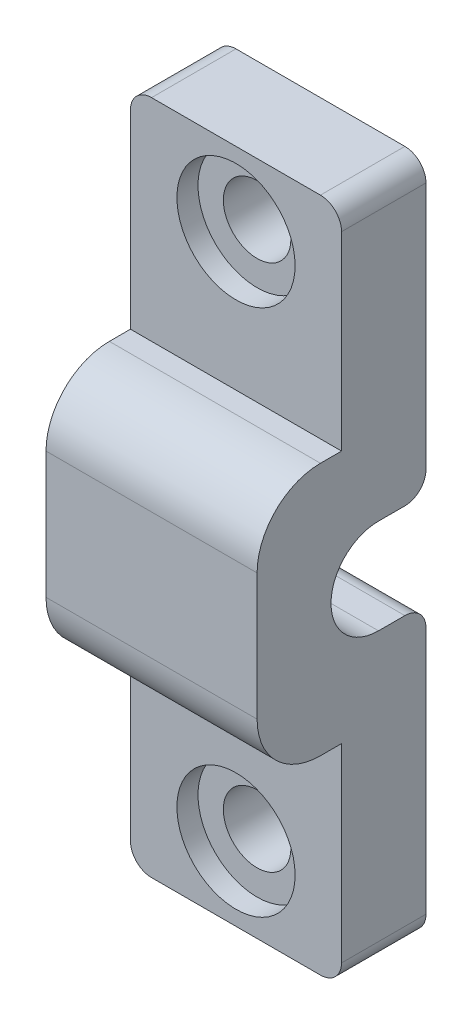
ISO-10303-21;
HEADER;
FILE_DESCRIPTION(('STEP AP214'),'2;1');
FILE_NAME('part.step','',(''),(''),'','','');
FILE_SCHEMA(('AUTOMOTIVE_DESIGN { 1 0 10303 214 1 1 1 1 }'));
ENDSEC;
DATA;
#1=APPLICATION_CONTEXT('core data for automotive mechanical design processes');
#2=APPLICATION_PROTOCOL_DEFINITION('international standard','automotive_design',2000,#1);
#3=PRODUCT_CONTEXT('',#1,'mechanical');
#4=PRODUCT('Part','Part','',(#3));
#5=PRODUCT_RELATED_PRODUCT_CATEGORY('part','',(#4));
#6=PRODUCT_DEFINITION_FORMATION('','',#4);
#7=PRODUCT_DEFINITION_CONTEXT('part definition',#1,'design');
#8=PRODUCT_DEFINITION('design','',#6,#7);
#9=PRODUCT_DEFINITION_SHAPE('','',#8);
#10=(LENGTH_UNIT() NAMED_UNIT(*) SI_UNIT(.MILLI.,.METRE.));
#11=(NAMED_UNIT(*) PLANE_ANGLE_UNIT() SI_UNIT($,.RADIAN.));
#12=(NAMED_UNIT(*) SI_UNIT($,.STERADIAN.) SOLID_ANGLE_UNIT());
#13=UNCERTAINTY_MEASURE_WITH_UNIT(LENGTH_MEASURE(1.E-05),#10,'distance_accuracy_value','');
#14=(GEOMETRIC_REPRESENTATION_CONTEXT(3) GLOBAL_UNCERTAINTY_ASSIGNED_CONTEXT((#13)) GLOBAL_UNIT_ASSIGNED_CONTEXT((#10,
#11,#12)) REPRESENTATION_CONTEXT('',''));
#15=CARTESIAN_POINT('',(0.,0.,0.));
#16=DIRECTION('',(0.,0.,1.));
#17=DIRECTION('',(1.,0.,0.));
#18=AXIS2_PLACEMENT_3D('',#15,#16,#17);
#19=CARTESIAN_POINT('',(5.,3.5,-4.5254833995939));
#20=DIRECTION('',(0.,0.,1.));
#21=DIRECTION('',(1.,0.,0.));
#22=AXIS2_PLACEMENT_3D('',#19,#20,#21);
#23=CYLINDRICAL_SURFACE('',#22,1.6);
#24=CARTESIAN_POINT('',(5.,3.5,0.));
#25=DIRECTION('',(0.,0.,-1.));
#26=DIRECTION('',(-1.,0.,0.));
#27=AXIS2_PLACEMENT_3D('',#24,#25,#26);
#28=CIRCLE('',#27,1.6);
#29=CARTESIAN_POINT('',(3.4,3.5,0.));
#30=VERTEX_POINT('',#29);
#31=EDGE_CURVE('E245',#30,#30,#28,.F.);
#32=ORIENTED_EDGE('',*,*,#31,.F.);
#33=EDGE_LOOP('',(#32));
#34=FACE_BOUND('',#33,.T.);
#35=CARTESIAN_POINT('',(5.,3.5,3.));
#36=DIRECTION('',(0.,0.,1.));
#37=DIRECTION('',(1.,0.,0.));
#38=AXIS2_PLACEMENT_3D('',#35,#36,#37);
#39=CIRCLE('',#38,1.6);
#40=CARTESIAN_POINT('',(6.6,3.5,3.));
#41=VERTEX_POINT('',#40);
#42=EDGE_CURVE('E41',#41,#41,#39,.F.);
#43=ORIENTED_EDGE('',*,*,#42,.F.);
#44=EDGE_LOOP('',(#43));
#45=FACE_BOUND('',#44,.T.);
#46=ADVANCED_FACE('F37',(#34,#45),#23,.F.);
#47=CARTESIAN_POINT('',(5.,28.5,-4.5254833995939));
#48=DIRECTION('',(0.,0.,1.));
#49=DIRECTION('',(1.,0.,0.));
#50=AXIS2_PLACEMENT_3D('',#47,#48,#49);
#51=CYLINDRICAL_SURFACE('',#50,1.6);
#52=CARTESIAN_POINT('',(5.,28.5,0.));
#53=DIRECTION('',(0.,0.,-1.));
#54=DIRECTION('',(-1.,0.,0.));
#55=AXIS2_PLACEMENT_3D('',#52,#53,#54);
#56=CIRCLE('',#55,1.6);
#57=CARTESIAN_POINT('',(3.4,28.5,0.));
#58=VERTEX_POINT('',#57);
#59=EDGE_CURVE('E246',#58,#58,#56,.F.);
#60=ORIENTED_EDGE('',*,*,#59,.F.);
#61=EDGE_LOOP('',(#60));
#62=FACE_BOUND('',#61,.T.);
#63=CARTESIAN_POINT('',(5.,28.5,3.));
#64=DIRECTION('',(0.,0.,1.));
#65=DIRECTION('',(1.,0.,0.));
#66=AXIS2_PLACEMENT_3D('',#63,#64,#65);
#67=CIRCLE('',#66,1.6);
#68=CARTESIAN_POINT('',(6.59999999999999,28.5,3.));
#69=VERTEX_POINT('',#68);
#70=EDGE_CURVE('E333',#69,#69,#67,.F.);
#71=ORIENTED_EDGE('',*,*,#70,.F.);
#72=EDGE_LOOP('',(#71));
#73=FACE_BOUND('',#72,.T.);
#74=ADVANCED_FACE('F445',(#62,#73),#51,.F.);
#75=CARTESIAN_POINT('',(0.,0.,8.));
#76=DIRECTION('',(1.,0.,0.));
#77=DIRECTION('',(0.,1.,0.));
#78=AXIS2_PLACEMENT_3D('',#75,#76,#77);
#79=PLANE('',#78);
#80=DIRECTION('',(0.,-1.,0.));
#81=VECTOR('',#80,1.);
#82=CARTESIAN_POINT('',(0.,32.,4.));
#83=LINE('',#82,#81);
#84=CARTESIAN_POINT('',(0.,31.,4.));
#85=VERTEX_POINT('',#84);
#86=CARTESIAN_POINT('',(0.,22.,4.));
#87=VERTEX_POINT('',#86);
#88=EDGE_CURVE('E177',#85,#87,#83,.T.);
#89=ORIENTED_EDGE('',*,*,#88,.F.);
#90=DIRECTION('',(0.,0.,-1.));
#91=VECTOR('',#90,1.);
#92=CARTESIAN_POINT('',(0.,31.,8.));
#93=LINE('',#92,#91);
#94=CARTESIAN_POINT('',(0.,31.,0.));
#95=VERTEX_POINT('',#94);
#96=EDGE_CURVE('E325',#85,#95,#93,.T.);
#97=ORIENTED_EDGE('',*,*,#96,.T.);
#98=DIRECTION('',(0.,-1.,0.));
#99=VECTOR('',#98,1.);
#100=CARTESIAN_POINT('',(0.,0.,0.));
#101=LINE('',#100,#99);
#102=CARTESIAN_POINT('',(0.,19.25,0.));
#103=VERTEX_POINT('',#102);
#104=EDGE_CURVE('E261',#95,#103,#101,.T.);
#105=ORIENTED_EDGE('',*,*,#104,.T.);
#106=CARTESIAN_POINT('',(0.,19.25,1.));
#107=DIRECTION('',(1.,0.,0.));
#108=DIRECTION('',(0.,1.,0.));
#109=AXIS2_PLACEMENT_3D('',#106,#107,#108);
#110=CIRCLE('',#109,1.);
#111=CARTESIAN_POINT('',(0.,18.25,1.));
#112=VERTEX_POINT('',#111);
#113=EDGE_CURVE('E272',#103,#112,#110,.F.);
#114=ORIENTED_EDGE('',*,*,#113,.T.);
#115=DIRECTION('',(0.,0.,-1.));
#116=VECTOR('',#115,1.);
#117=CARTESIAN_POINT('',(0.,18.25,0.));
#118=LINE('',#117,#116);
#119=CARTESIAN_POINT('',(0.,18.25,2.25));
#120=VERTEX_POINT('',#119);
#121=EDGE_CURVE('E235',#120,#112,#118,.T.);
#122=ORIENTED_EDGE('',*,*,#121,.F.);
#123=CARTESIAN_POINT('',(0.,16.,2.25));
#124=DIRECTION('',(-1.,0.,0.));
#125=DIRECTION('',(0.,-1.,0.));
#126=AXIS2_PLACEMENT_3D('',#123,#124,#125);
#127=CIRCLE('',#126,2.25);
#128=CARTESIAN_POINT('',(0.,13.75,2.25));
#129=VERTEX_POINT('',#128);
#130=EDGE_CURVE('E232',#129,#120,#127,.T.);
#131=ORIENTED_EDGE('',*,*,#130,.F.);
#132=DIRECTION('',(0.,0.,-1.));
#133=VECTOR('',#132,1.);
#134=CARTESIAN_POINT('',(0.,13.75,0.));
#135=LINE('',#134,#133);
#136=CARTESIAN_POINT('',(0.,13.75,1.));
#137=VERTEX_POINT('',#136);
#138=EDGE_CURVE('E238',#129,#137,#135,.T.);
#139=ORIENTED_EDGE('',*,*,#138,.T.);
#140=CARTESIAN_POINT('',(0.,12.75,1.));
#141=DIRECTION('',(1.,0.,0.));
#142=DIRECTION('',(0.,1.,0.));
#143=AXIS2_PLACEMENT_3D('',#140,#141,#142);
#144=CIRCLE('',#143,1.);
#145=CARTESIAN_POINT('',(0.,12.75,0.));
#146=VERTEX_POINT('',#145);
#147=EDGE_CURVE('E274',#137,#146,#144,.F.);
#148=ORIENTED_EDGE('',*,*,#147,.T.);
#149=CARTESIAN_POINT('',(0.,1.,0.));
#150=VERTEX_POINT('',#149);
#151=EDGE_CURVE('E250',#146,#150,#101,.T.);
#152=ORIENTED_EDGE('',*,*,#151,.T.);
#153=DIRECTION('',(0.,0.,-1.));
#154=VECTOR('',#153,1.);
#155=CARTESIAN_POINT('',(0.,1.,8.));
#156=LINE('',#155,#154);
#157=CARTESIAN_POINT('',(0.,1.,4.));
#158=VERTEX_POINT('',#157);
#159=EDGE_CURVE('E323',#150,#158,#156,.F.);
#160=ORIENTED_EDGE('',*,*,#159,.T.);
#161=DIRECTION('',(0.,-1.,0.));
#162=VECTOR('',#161,1.);
#163=CARTESIAN_POINT('',(0.,0.,4.));
#164=LINE('',#163,#162);
#165=CARTESIAN_POINT('',(0.,10.,4.));
#166=VERTEX_POINT('',#165);
#167=EDGE_CURVE('E215',#166,#158,#164,.T.);
#168=ORIENTED_EDGE('',*,*,#167,.F.);
#169=DIRECTION('',(0.,0.,-1.));
#170=VECTOR('',#169,1.);
#171=CARTESIAN_POINT('',(0.,10.,8.));
#172=LINE('',#171,#170);
#173=CARTESIAN_POINT('',(0.,10.,5.));
#174=VERTEX_POINT('',#173);
#175=EDGE_CURVE('E213',#174,#166,#172,.T.);
#176=ORIENTED_EDGE('',*,*,#175,.F.);
#177=CARTESIAN_POINT('',(0.,13.,5.));
#178=DIRECTION('',(1.,0.,0.));
#179=DIRECTION('',(0.,1.,0.));
#180=AXIS2_PLACEMENT_3D('',#177,#178,#179);
#181=CIRCLE('',#180,3.);
#182=CARTESIAN_POINT('',(0.,13.,8.));
#183=VERTEX_POINT('',#182);
#184=EDGE_CURVE('E292',#174,#183,#181,.F.);
#185=ORIENTED_EDGE('',*,*,#184,.T.);
#186=DIRECTION('',(0.,-1.,0.));
#187=VECTOR('',#186,1.);
#188=CARTESIAN_POINT('',(0.,0.,8.));
#189=LINE('',#188,#187);
#190=CARTESIAN_POINT('',(0.,19.,8.));
#191=VERTEX_POINT('',#190);
#192=EDGE_CURVE('E253',#191,#183,#189,.T.);
#193=ORIENTED_EDGE('',*,*,#192,.F.);
#194=CARTESIAN_POINT('',(0.,19.,5.));
#195=DIRECTION('',(1.,0.,0.));
#196=DIRECTION('',(0.,1.,0.));
#197=AXIS2_PLACEMENT_3D('',#194,#195,#196);
#198=CIRCLE('',#197,3.);
#199=CARTESIAN_POINT('',(0.,22.,5.));
#200=VERTEX_POINT('',#199);
#201=EDGE_CURVE('E205',#191,#200,#198,.F.);
#202=ORIENTED_EDGE('',*,*,#201,.T.);
#203=DIRECTION('',(0.,0.,1.));
#204=VECTOR('',#203,1.);
#205=CARTESIAN_POINT('',(0.,22.,8.));
#206=LINE('',#205,#204);
#207=EDGE_CURVE('E190',#87,#200,#206,.T.);
#208=ORIENTED_EDGE('',*,*,#207,.F.);
#209=EDGE_LOOP('',(#89,#97,#105,#114,#122,#131,#139,#148,#152,#160,#168,#176,#185,#193,#202,#208));
#210=FACE_BOUND('',#209,.T.);
#211=ADVANCED_FACE('F203',(#210),#79,.F.);
#212=CARTESIAN_POINT('',(10.,0.,8.));
#213=DIRECTION('',(-1.,0.,0.));
#214=DIRECTION('',(0.,-1.,0.));
#215=AXIS2_PLACEMENT_3D('',#212,#213,#214);
#216=PLANE('',#215);
#217=DIRECTION('',(0.,1.,0.));
#218=VECTOR('',#217,1.);
#219=CARTESIAN_POINT('',(10.,0.,0.));
#220=LINE('',#219,#218);
#221=CARTESIAN_POINT('',(10.,19.25,0.));
#222=VERTEX_POINT('',#221);
#223=CARTESIAN_POINT('',(10.,31.,0.));
#224=VERTEX_POINT('',#223);
#225=EDGE_CURVE('E265',#222,#224,#220,.T.);
#226=ORIENTED_EDGE('',*,*,#225,.T.);
#227=DIRECTION('',(0.,0.,-1.));
#228=VECTOR('',#227,1.);
#229=CARTESIAN_POINT('',(10.,31.,8.));
#230=LINE('',#229,#228);
#231=CARTESIAN_POINT('',(10.,31.,4.));
#232=VERTEX_POINT('',#231);
#233=EDGE_CURVE('E318',#224,#232,#230,.F.);
#234=ORIENTED_EDGE('',*,*,#233,.T.);
#235=DIRECTION('',(0.,1.,0.));
#236=VECTOR('',#235,1.);
#237=CARTESIAN_POINT('',(10.,32.,4.));
#238=LINE('',#237,#236);
#239=CARTESIAN_POINT('',(10.,22.,4.));
#240=VERTEX_POINT('',#239);
#241=EDGE_CURVE('E200',#240,#232,#238,.T.);
#242=ORIENTED_EDGE('',*,*,#241,.F.);
#243=DIRECTION('',(0.,0.,-1.));
#244=VECTOR('',#243,1.);
#245=CARTESIAN_POINT('',(10.,22.,8.));
#246=LINE('',#245,#244);
#247=CARTESIAN_POINT('',(10.,22.,5.));
#248=VERTEX_POINT('',#247);
#249=EDGE_CURVE('E198',#248,#240,#246,.T.);
#250=ORIENTED_EDGE('',*,*,#249,.F.);
#251=CARTESIAN_POINT('',(10.,19.,5.));
#252=DIRECTION('',(-1.,0.,0.));
#253=DIRECTION('',(0.,-1.,0.));
#254=AXIS2_PLACEMENT_3D('',#251,#252,#253);
#255=CIRCLE('',#254,3.);
#256=CARTESIAN_POINT('',(10.,19.,8.));
#257=VERTEX_POINT('',#256);
#258=EDGE_CURVE('E299',#248,#257,#255,.F.);
#259=ORIENTED_EDGE('',*,*,#258,.T.);
#260=DIRECTION('',(0.,1.,0.));
#261=VECTOR('',#260,1.);
#262=CARTESIAN_POINT('',(10.,0.,8.));
#263=LINE('',#262,#261);
#264=CARTESIAN_POINT('',(10.,13.,8.));
#265=VERTEX_POINT('',#264);
#266=EDGE_CURVE('E256',#265,#257,#263,.T.);
#267=ORIENTED_EDGE('',*,*,#266,.F.);
#268=CARTESIAN_POINT('',(10.,13.,5.));
#269=DIRECTION('',(-1.,0.,0.));
#270=DIRECTION('',(0.,-1.,0.));
#271=AXIS2_PLACEMENT_3D('',#268,#269,#270);
#272=CIRCLE('',#271,3.);
#273=CARTESIAN_POINT('',(10.,10.,5.));
#274=VERTEX_POINT('',#273);
#275=EDGE_CURVE('E301',#265,#274,#272,.F.);
#276=ORIENTED_EDGE('',*,*,#275,.T.);
#277=DIRECTION('',(0.,0.,1.));
#278=VECTOR('',#277,1.);
#279=CARTESIAN_POINT('',(10.,10.,8.));
#280=LINE('',#279,#278);
#281=CARTESIAN_POINT('',(10.,10.,4.));
#282=VERTEX_POINT('',#281);
#283=EDGE_CURVE('E191',#282,#274,#280,.T.);
#284=ORIENTED_EDGE('',*,*,#283,.F.);
#285=DIRECTION('',(0.,1.,0.));
#286=VECTOR('',#285,1.);
#287=CARTESIAN_POINT('',(10.,0.,4.));
#288=LINE('',#287,#286);
#289=CARTESIAN_POINT('',(10.,1.,4.));
#290=VERTEX_POINT('',#289);
#291=EDGE_CURVE('E210',#290,#282,#288,.T.);
#292=ORIENTED_EDGE('',*,*,#291,.F.);
#293=DIRECTION('',(0.,0.,-1.));
#294=VECTOR('',#293,1.);
#295=CARTESIAN_POINT('',(10.,1.,8.));
#296=LINE('',#295,#294);
#297=CARTESIAN_POINT('',(10.,1.,0.));
#298=VERTEX_POINT('',#297);
#299=EDGE_CURVE('E315',#290,#298,#296,.T.);
#300=ORIENTED_EDGE('',*,*,#299,.T.);
#301=CARTESIAN_POINT('',(10.,12.75,0.));
#302=VERTEX_POINT('',#301);
#303=EDGE_CURVE('E266',#298,#302,#220,.T.);
#304=ORIENTED_EDGE('',*,*,#303,.T.);
#305=CARTESIAN_POINT('',(10.,12.75,1.));
#306=DIRECTION('',(-1.,0.,0.));
#307=DIRECTION('',(0.,-1.,0.));
#308=AXIS2_PLACEMENT_3D('',#305,#306,#307);
#309=CIRCLE('',#308,1.);
#310=CARTESIAN_POINT('',(10.,13.75,1.));
#311=VERTEX_POINT('',#310);
#312=EDGE_CURVE('E281',#302,#311,#309,.F.);
#313=ORIENTED_EDGE('',*,*,#312,.T.);
#314=DIRECTION('',(0.,0.,1.));
#315=VECTOR('',#314,1.);
#316=CARTESIAN_POINT('',(10.,13.75,0.));
#317=LINE('',#316,#315);
#318=CARTESIAN_POINT('',(10.,13.75,2.25));
#319=VERTEX_POINT('',#318);
#320=EDGE_CURVE('E225',#311,#319,#317,.T.);
#321=ORIENTED_EDGE('',*,*,#320,.T.);
#322=CARTESIAN_POINT('',(10.,16.,2.25));
#323=DIRECTION('',(-1.,0.,0.));
#324=DIRECTION('',(0.,-1.,0.));
#325=AXIS2_PLACEMENT_3D('',#322,#323,#324);
#326=CIRCLE('',#325,2.25);
#327=CARTESIAN_POINT('',(10.,18.25,2.25));
#328=VERTEX_POINT('',#327);
#329=EDGE_CURVE('E227',#328,#319,#326,.F.);
#330=ORIENTED_EDGE('',*,*,#329,.F.);
#331=DIRECTION('',(0.,0.,1.));
#332=VECTOR('',#331,1.);
#333=CARTESIAN_POINT('',(10.,18.25,0.));
#334=LINE('',#333,#332);
#335=CARTESIAN_POINT('',(10.,18.25,1.));
#336=VERTEX_POINT('',#335);
#337=EDGE_CURVE('E231',#336,#328,#334,.T.);
#338=ORIENTED_EDGE('',*,*,#337,.F.);
#339=CARTESIAN_POINT('',(10.,19.25,1.));
#340=DIRECTION('',(-1.,0.,0.));
#341=DIRECTION('',(0.,-1.,0.));
#342=AXIS2_PLACEMENT_3D('',#339,#340,#341);
#343=CIRCLE('',#342,1.);
#344=EDGE_CURVE('E279',#336,#222,#343,.F.);
#345=ORIENTED_EDGE('',*,*,#344,.T.);
#346=EDGE_LOOP('',(#226,#234,#242,#250,#259,#267,#276,#284,#292,#300,#304,#313,#321,#330,#338,#345));
#347=FACE_BOUND('',#346,.T.);
#348=ADVANCED_FACE('F384',(#347),#216,.F.);
#349=CARTESIAN_POINT('',(0.,0.,0.));
#350=DIRECTION('',(0.,0.,-1.));
#351=DIRECTION('',(-1.,0.,0.));
#352=AXIS2_PLACEMENT_3D('',#349,#350,#351);
#353=PLANE('',#352);
#354=ORIENTED_EDGE('',*,*,#31,.T.);
#355=EDGE_LOOP('',(#354));
#356=FACE_BOUND('',#355,.T.);
#357=DIRECTION('',(1.,0.,0.));
#358=VECTOR('',#357,1.);
#359=CARTESIAN_POINT('',(0.,0.,0.));
#360=LINE('',#359,#358);
#361=CARTESIAN_POINT('',(1.,0.,0.));
#362=VERTEX_POINT('',#361);
#363=CARTESIAN_POINT('',(9.,0.,0.));
#364=VERTEX_POINT('',#363);
#365=EDGE_CURVE('E263',#362,#364,#360,.T.);
#366=ORIENTED_EDGE('',*,*,#365,.F.);
#367=CARTESIAN_POINT('',(1.,1.,0.));
#368=DIRECTION('',(0.,0.,-1.));
#369=DIRECTION('',(-1.,0.,0.));
#370=AXIS2_PLACEMENT_3D('',#367,#368,#369);
#371=CIRCLE('',#370,1.);
#372=EDGE_CURVE('E62',#362,#150,#371,.T.);
#373=ORIENTED_EDGE('',*,*,#372,.T.);
#374=ORIENTED_EDGE('',*,*,#151,.F.);
#375=DIRECTION('',(-1.,0.,0.));
#376=VECTOR('',#375,1.);
#377=CARTESIAN_POINT('',(0.,12.75,0.));
#378=LINE('',#377,#376);
#379=EDGE_CURVE('E276',#146,#302,#378,.F.);
#380=ORIENTED_EDGE('',*,*,#379,.T.);
#381=ORIENTED_EDGE('',*,*,#303,.F.);
#382=CARTESIAN_POINT('',(9.,1.,0.));
#383=DIRECTION('',(0.,0.,-1.));
#384=DIRECTION('',(-1.,0.,0.));
#385=AXIS2_PLACEMENT_3D('',#382,#383,#384);
#386=CIRCLE('',#385,1.);
#387=EDGE_CURVE('E54',#298,#364,#386,.T.);
#388=ORIENTED_EDGE('',*,*,#387,.T.);
#389=EDGE_LOOP('',(#366,#373,#374,#380,#381,#388));
#390=FACE_BOUND('',#389,.T.);
#391=ADVANCED_FACE('F405',(#356,#390),#353,.T.);
#392=CARTESIAN_POINT('',(0.,0.,8.));
#393=DIRECTION('',(0.,1.,0.));
#394=DIRECTION('',(0.,0.,1.));
#395=AXIS2_PLACEMENT_3D('',#392,#393,#394);
#396=PLANE('',#395);
#397=DIRECTION('',(-1.,0.,0.));
#398=VECTOR('',#397,1.);
#399=CARTESIAN_POINT('',(20.770329614269,0.,4.));
#400=LINE('',#399,#398);
#401=CARTESIAN_POINT('',(9.,0.,4.));
#402=VERTEX_POINT('',#401);
#403=CARTESIAN_POINT('',(1.,0.,4.));
#404=VERTEX_POINT('',#403);
#405=EDGE_CURVE('E212',#402,#404,#400,.T.);
#406=ORIENTED_EDGE('',*,*,#405,.T.);
#407=DIRECTION('',(0.,0.,-1.));
#408=VECTOR('',#407,1.);
#409=CARTESIAN_POINT('',(1.,0.,8.));
#410=LINE('',#409,#408);
#411=EDGE_CURVE('E329',#404,#362,#410,.T.);
#412=ORIENTED_EDGE('',*,*,#411,.T.);
#413=ORIENTED_EDGE('',*,*,#365,.T.);
#414=DIRECTION('',(0.,0.,-1.));
#415=VECTOR('',#414,1.);
#416=CARTESIAN_POINT('',(9.,0.,8.));
#417=LINE('',#416,#415);
#418=EDGE_CURVE('E327',#364,#402,#417,.F.);
#419=ORIENTED_EDGE('',*,*,#418,.T.);
#420=EDGE_LOOP('',(#406,#412,#413,#419));
#421=FACE_BOUND('',#420,.T.);
#422=ADVANCED_FACE('F414',(#421),#396,.F.);
#423=CARTESIAN_POINT('',(0.,32.,8.));
#424=DIRECTION('',(0.,-1.,0.));
#425=DIRECTION('',(0.,0.,-1.));
#426=AXIS2_PLACEMENT_3D('',#423,#424,#425);
#427=PLANE('',#426);
#428=DIRECTION('',(-1.,0.,0.));
#429=VECTOR('',#428,1.);
#430=CARTESIAN_POINT('',(20.770329614269,32.,4.));
#431=LINE('',#430,#429);
#432=CARTESIAN_POINT('',(9.,32.,4.));
#433=VERTEX_POINT('',#432);
#434=CARTESIAN_POINT('',(0.999999999999997,32.,4.));
#435=VERTEX_POINT('',#434);
#436=EDGE_CURVE('E201',#433,#435,#431,.T.);
#437=ORIENTED_EDGE('',*,*,#436,.F.);
#438=DIRECTION('',(0.,0.,-1.));
#439=VECTOR('',#438,1.);
#440=CARTESIAN_POINT('',(9.,32.,8.));
#441=LINE('',#440,#439);
#442=CARTESIAN_POINT('',(9.,32.,0.));
#443=VERTEX_POINT('',#442);
#444=EDGE_CURVE('E308',#433,#443,#441,.T.);
#445=ORIENTED_EDGE('',*,*,#444,.T.);
#446=DIRECTION('',(-1.,0.,0.));
#447=VECTOR('',#446,1.);
#448=CARTESIAN_POINT('',(0.,32.,0.));
#449=LINE('',#448,#447);
#450=CARTESIAN_POINT('',(0.999999999999997,32.,0.));
#451=VERTEX_POINT('',#450);
#452=EDGE_CURVE('E257',#443,#451,#449,.T.);
#453=ORIENTED_EDGE('',*,*,#452,.T.);
#454=DIRECTION('',(0.,0.,-1.));
#455=VECTOR('',#454,1.);
#456=CARTESIAN_POINT('',(0.999999999999997,32.,8.));
#457=LINE('',#456,#455);
#458=EDGE_CURVE('E306',#451,#435,#457,.F.);
#459=ORIENTED_EDGE('',*,*,#458,.T.);
#460=EDGE_LOOP('',(#437,#445,#453,#459));
#461=FACE_BOUND('',#460,.T.);
#462=ADVANCED_FACE('F367',(#461),#427,.F.);
#463=CARTESIAN_POINT('',(0.,0.,8.));
#464=DIRECTION('',(0.,0.,-1.));
#465=DIRECTION('',(-1.,0.,0.));
#466=AXIS2_PLACEMENT_3D('',#463,#464,#465);
#467=PLANE('',#466);
#468=ORIENTED_EDGE('',*,*,#192,.T.);
#469=DIRECTION('',(-1.,0.,0.));
#470=VECTOR('',#469,1.);
#471=CARTESIAN_POINT('',(0.,13.,8.));
#472=LINE('',#471,#470);
#473=EDGE_CURVE('E297',#183,#265,#472,.F.);
#474=ORIENTED_EDGE('',*,*,#473,.T.);
#475=ORIENTED_EDGE('',*,*,#266,.T.);
#476=DIRECTION('',(-1.,0.,0.));
#477=VECTOR('',#476,1.);
#478=CARTESIAN_POINT('',(0.,19.,8.));
#479=LINE('',#478,#477);
#480=EDGE_CURVE('E294',#257,#191,#479,.T.);
#481=ORIENTED_EDGE('',*,*,#480,.T.);
#482=EDGE_LOOP('',(#468,#474,#475,#481));
#483=FACE_BOUND('',#482,.T.);
#484=ADVANCED_FACE('F431',(#483),#467,.F.);
#485=ORIENTED_EDGE('',*,*,#452,.F.);
#486=CARTESIAN_POINT('',(9.,31.,0.));
#487=DIRECTION('',(0.,0.,-1.));
#488=DIRECTION('',(-1.,0.,0.));
#489=AXIS2_PLACEMENT_3D('',#486,#487,#488);
#490=CIRCLE('',#489,1.);
#491=EDGE_CURVE('E313',#443,#224,#490,.T.);
#492=ORIENTED_EDGE('',*,*,#491,.T.);
#493=ORIENTED_EDGE('',*,*,#225,.F.);
#494=DIRECTION('',(-1.,0.,0.));
#495=VECTOR('',#494,1.);
#496=CARTESIAN_POINT('',(0.,19.25,0.));
#497=LINE('',#496,#495);
#498=EDGE_CURVE('E283',#222,#103,#497,.T.);
#499=ORIENTED_EDGE('',*,*,#498,.T.);
#500=ORIENTED_EDGE('',*,*,#104,.F.);
#501=CARTESIAN_POINT('',(0.999999999999997,31.,0.));
#502=DIRECTION('',(0.,0.,-1.));
#503=DIRECTION('',(-1.,0.,0.));
#504=AXIS2_PLACEMENT_3D('',#501,#502,#503);
#505=CIRCLE('',#504,1.);
#506=EDGE_CURVE('E311',#95,#451,#505,.T.);
#507=ORIENTED_EDGE('',*,*,#506,.T.);
#508=EDGE_LOOP('',(#485,#492,#493,#499,#500,#507));
#509=FACE_BOUND('',#508,.T.);
#510=ORIENTED_EDGE('',*,*,#59,.T.);
#511=EDGE_LOOP('',(#510));
#512=FACE_BOUND('',#511,.T.);
#513=ADVANCED_FACE('F370',(#509,#512),#353,.T.);
#514=CARTESIAN_POINT('',(16.3639610306789,16.,2.25));
#515=DIRECTION('',(-1.,0.,0.));
#516=DIRECTION('',(0.,-1.,0.));
#517=AXIS2_PLACEMENT_3D('',#514,#515,#516);
#518=CYLINDRICAL_SURFACE('',#517,2.25);
#519=ORIENTED_EDGE('',*,*,#329,.T.);
#520=DIRECTION('',(-1.,0.,0.));
#521=VECTOR('',#520,1.);
#522=CARTESIAN_POINT('',(16.3639610306789,13.75,2.25));
#523=LINE('',#522,#521);
#524=EDGE_CURVE('E228',#319,#129,#523,.T.);
#525=ORIENTED_EDGE('',*,*,#524,.T.);
#526=ORIENTED_EDGE('',*,*,#130,.T.);
#527=DIRECTION('',(-1.,0.,0.));
#528=VECTOR('',#527,1.);
#529=CARTESIAN_POINT('',(16.3639610306789,18.25,2.25));
#530=LINE('',#529,#528);
#531=EDGE_CURVE('E241',#328,#120,#530,.T.);
#532=ORIENTED_EDGE('',*,*,#531,.F.);
#533=EDGE_LOOP('',(#519,#525,#526,#532));
#534=FACE_BOUND('',#533,.T.);
#535=ADVANCED_FACE('F391',(#534),#518,.F.);
#536=CARTESIAN_POINT('',(16.3639610306789,13.75,0.));
#537=DIRECTION('',(0.,1.,0.));
#538=DIRECTION('',(-1.,0.,0.));
#539=AXIS2_PLACEMENT_3D('',#536,#537,#538);
#540=PLANE('',#539);
#541=ORIENTED_EDGE('',*,*,#320,.F.);
#542=DIRECTION('',(-1.,0.,0.));
#543=VECTOR('',#542,1.);
#544=CARTESIAN_POINT('',(16.3639610306789,13.75,1.));
#545=LINE('',#544,#543);
#546=EDGE_CURVE('E260',#311,#137,#545,.T.);
#547=ORIENTED_EDGE('',*,*,#546,.T.);
#548=ORIENTED_EDGE('',*,*,#138,.F.);
#549=ORIENTED_EDGE('',*,*,#524,.F.);
#550=EDGE_LOOP('',(#541,#547,#548,#549));
#551=FACE_BOUND('',#550,.T.);
#552=ADVANCED_FACE('F399',(#551),#540,.T.);
#553=CARTESIAN_POINT('',(16.3639610306789,18.25,0.));
#554=DIRECTION('',(0.,1.,0.));
#555=DIRECTION('',(-1.,0.,0.));
#556=AXIS2_PLACEMENT_3D('',#553,#554,#555);
#557=PLANE('',#556);
#558=ORIENTED_EDGE('',*,*,#121,.T.);
#559=DIRECTION('',(-1.,0.,0.));
#560=VECTOR('',#559,1.);
#561=CARTESIAN_POINT('',(10.,18.25,1.));
#562=LINE('',#561,#560);
#563=EDGE_CURVE('E286',#112,#336,#562,.F.);
#564=ORIENTED_EDGE('',*,*,#563,.T.);
#565=ORIENTED_EDGE('',*,*,#337,.T.);
#566=ORIENTED_EDGE('',*,*,#531,.T.);
#567=EDGE_LOOP('',(#558,#564,#565,#566));
#568=FACE_BOUND('',#567,.T.);
#569=ADVANCED_FACE('F389',(#568),#557,.F.);
#570=CARTESIAN_POINT('',(16.3639610306789,12.75,1.));
#571=DIRECTION('',(-1.,0.,0.));
#572=DIRECTION('',(0.,-1.,0.));
#573=AXIS2_PLACEMENT_3D('',#570,#571,#572);
#574=CYLINDRICAL_SURFACE('',#573,1.);
#575=ORIENTED_EDGE('',*,*,#312,.F.);
#576=ORIENTED_EDGE('',*,*,#379,.F.);
#577=ORIENTED_EDGE('',*,*,#147,.F.);
#578=ORIENTED_EDGE('',*,*,#546,.F.);
#579=EDGE_LOOP('',(#575,#576,#577,#578));
#580=FACE_BOUND('',#579,.T.);
#581=ADVANCED_FACE('F403',(#580),#574,.T.);
#582=CARTESIAN_POINT('',(0.,19.25,1.));
#583=DIRECTION('',(1.,0.,0.));
#584=DIRECTION('',(0.,1.,0.));
#585=AXIS2_PLACEMENT_3D('',#582,#583,#584);
#586=CYLINDRICAL_SURFACE('',#585,1.);
#587=ORIENTED_EDGE('',*,*,#344,.F.);
#588=ORIENTED_EDGE('',*,*,#563,.F.);
#589=ORIENTED_EDGE('',*,*,#113,.F.);
#590=ORIENTED_EDGE('',*,*,#498,.F.);
#591=EDGE_LOOP('',(#587,#588,#589,#590));
#592=FACE_BOUND('',#591,.T.);
#593=ADVANCED_FACE('F383',(#592),#586,.T.);
#594=CARTESIAN_POINT('',(20.770329614269,32.,4.));
#595=DIRECTION('',(0.,0.,-1.));
#596=DIRECTION('',(0.,1.,0.));
#597=AXIS2_PLACEMENT_3D('',#594,#595,#596);
#598=PLANE('',#597);
#599=CARTESIAN_POINT('',(5.,28.5,4.));
#600=DIRECTION('',(0.,0.,1.));
#601=DIRECTION('',(1.,0.,0.));
#602=AXIS2_PLACEMENT_3D('',#599,#600,#601);
#603=CIRCLE('',#602,2.8);
#604=CARTESIAN_POINT('',(7.8,28.5,4.));
#605=VERTEX_POINT('',#604);
#606=EDGE_CURVE('E343',#605,#605,#603,.T.);
#607=ORIENTED_EDGE('',*,*,#606,.F.);
#608=EDGE_LOOP('',(#607));
#609=FACE_BOUND('',#608,.T.);
#610=ORIENTED_EDGE('',*,*,#241,.T.);
#611=CARTESIAN_POINT('',(9.,31.,4.));
#612=DIRECTION('',(0.,0.,-1.));
#613=DIRECTION('',(0.,1.,0.));
#614=AXIS2_PLACEMENT_3D('',#611,#612,#613);
#615=CIRCLE('',#614,1.);
#616=EDGE_CURVE('E321',#232,#433,#615,.F.);
#617=ORIENTED_EDGE('',*,*,#616,.T.);
#618=ORIENTED_EDGE('',*,*,#436,.T.);
#619=CARTESIAN_POINT('',(0.999999999999997,31.,4.));
#620=DIRECTION('',(0.,0.,-1.));
#621=DIRECTION('',(0.,1.,0.));
#622=AXIS2_PLACEMENT_3D('',#619,#620,#621);
#623=CIRCLE('',#622,1.);
#624=EDGE_CURVE('E185',#435,#85,#623,.F.);
#625=ORIENTED_EDGE('',*,*,#624,.T.);
#626=ORIENTED_EDGE('',*,*,#88,.T.);
#627=DIRECTION('',(-1.,0.,0.));
#628=VECTOR('',#627,1.);
#629=CARTESIAN_POINT('',(20.770329614269,22.,4.));
#630=LINE('',#629,#628);
#631=EDGE_CURVE('E181',#240,#87,#630,.T.);
#632=ORIENTED_EDGE('',*,*,#631,.F.);
#633=EDGE_LOOP('',(#610,#617,#618,#625,#626,#632));
#634=FACE_BOUND('',#633,.T.);
#635=ADVANCED_FACE('F180',(#609,#634),#598,.F.);
#636=CARTESIAN_POINT('',(20.770329614269,22.,8.));
#637=DIRECTION('',(0.,-1.,0.));
#638=DIRECTION('',(1.,0.,0.));
#639=AXIS2_PLACEMENT_3D('',#636,#637,#638);
#640=PLANE('',#639);
#641=ORIENTED_EDGE('',*,*,#207,.T.);
#642=DIRECTION('',(-1.,0.,0.));
#643=VECTOR('',#642,1.);
#644=CARTESIAN_POINT('',(20.770329614269,22.,5.));
#645=LINE('',#644,#643);
#646=EDGE_CURVE('E303',#200,#248,#645,.F.);
#647=ORIENTED_EDGE('',*,*,#646,.T.);
#648=ORIENTED_EDGE('',*,*,#249,.T.);
#649=ORIENTED_EDGE('',*,*,#631,.T.);
#650=EDGE_LOOP('',(#641,#647,#648,#649));
#651=FACE_BOUND('',#650,.T.);
#652=ADVANCED_FACE('F195',(#651),#640,.F.);
#653=CARTESIAN_POINT('',(20.770329614269,0.,4.));
#654=DIRECTION('',(0.,0.,-1.));
#655=DIRECTION('',(-1.,0.,0.));
#656=AXIS2_PLACEMENT_3D('',#653,#654,#655);
#657=PLANE('',#656);
#658=CARTESIAN_POINT('',(5.,3.5,4.));
#659=DIRECTION('',(0.,0.,1.));
#660=DIRECTION('',(1.,0.,0.));
#661=AXIS2_PLACEMENT_3D('',#658,#659,#660);
#662=CIRCLE('',#661,2.8);
#663=CARTESIAN_POINT('',(7.8,3.5,4.));
#664=VERTEX_POINT('',#663);
#665=EDGE_CURVE('E355',#664,#664,#662,.T.);
#666=ORIENTED_EDGE('',*,*,#665,.F.);
#667=EDGE_LOOP('',(#666));
#668=FACE_BOUND('',#667,.T.);
#669=ORIENTED_EDGE('',*,*,#167,.T.);
#670=CARTESIAN_POINT('',(1.,1.,4.));
#671=DIRECTION('',(0.,0.,-1.));
#672=DIRECTION('',(-1.,0.,0.));
#673=AXIS2_PLACEMENT_3D('',#670,#671,#672);
#674=CIRCLE('',#673,1.);
#675=EDGE_CURVE('E11',#158,#404,#674,.F.);
#676=ORIENTED_EDGE('',*,*,#675,.T.);
#677=ORIENTED_EDGE('',*,*,#405,.F.);
#678=CARTESIAN_POINT('',(9.,1.,4.));
#679=DIRECTION('',(0.,0.,-1.));
#680=DIRECTION('',(-1.,0.,0.));
#681=AXIS2_PLACEMENT_3D('',#678,#679,#680);
#682=CIRCLE('',#681,1.);
#683=EDGE_CURVE('E46',#402,#290,#682,.F.);
#684=ORIENTED_EDGE('',*,*,#683,.T.);
#685=ORIENTED_EDGE('',*,*,#291,.T.);
#686=DIRECTION('',(-1.,0.,0.));
#687=VECTOR('',#686,1.);
#688=CARTESIAN_POINT('',(20.770329614269,10.,4.));
#689=LINE('',#688,#687);
#690=EDGE_CURVE('E218',#282,#166,#689,.T.);
#691=ORIENTED_EDGE('',*,*,#690,.T.);
#692=EDGE_LOOP('',(#669,#676,#677,#684,#685,#691));
#693=FACE_BOUND('',#692,.T.);
#694=ADVANCED_FACE('F411',(#668,#693),#657,.F.);
#695=CARTESIAN_POINT('',(20.770329614269,10.,8.));
#696=DIRECTION('',(0.,1.,0.));
#697=DIRECTION('',(0.,0.,1.));
#698=AXIS2_PLACEMENT_3D('',#695,#696,#697);
#699=PLANE('',#698);
#700=ORIENTED_EDGE('',*,*,#283,.T.);
#701=DIRECTION('',(-1.,0.,0.));
#702=VECTOR('',#701,1.);
#703=CARTESIAN_POINT('',(20.770329614269,10.,5.));
#704=LINE('',#703,#702);
#705=EDGE_CURVE('E288',#274,#174,#704,.T.);
#706=ORIENTED_EDGE('',*,*,#705,.T.);
#707=ORIENTED_EDGE('',*,*,#175,.T.);
#708=ORIENTED_EDGE('',*,*,#690,.F.);
#709=EDGE_LOOP('',(#700,#706,#707,#708));
#710=FACE_BOUND('',#709,.T.);
#711=ADVANCED_FACE('F425',(#710),#699,.F.);
#712=CARTESIAN_POINT('',(20.770329614269,13.,5.));
#713=DIRECTION('',(-1.,0.,0.));
#714=DIRECTION('',(0.,-1.,0.));
#715=AXIS2_PLACEMENT_3D('',#712,#713,#714);
#716=CYLINDRICAL_SURFACE('',#715,3.);
#717=ORIENTED_EDGE('',*,*,#275,.F.);
#718=ORIENTED_EDGE('',*,*,#473,.F.);
#719=ORIENTED_EDGE('',*,*,#184,.F.);
#720=ORIENTED_EDGE('',*,*,#705,.F.);
#721=EDGE_LOOP('',(#717,#718,#719,#720));
#722=FACE_BOUND('',#721,.T.);
#723=ADVANCED_FACE('F428',(#722),#716,.T.);
#724=CARTESIAN_POINT('',(0.,19.,5.));
#725=DIRECTION('',(-1.,0.,0.));
#726=DIRECTION('',(0.,-1.,0.));
#727=AXIS2_PLACEMENT_3D('',#724,#725,#726);
#728=CYLINDRICAL_SURFACE('',#727,3.);
#729=ORIENTED_EDGE('',*,*,#258,.F.);
#730=ORIENTED_EDGE('',*,*,#646,.F.);
#731=ORIENTED_EDGE('',*,*,#201,.F.);
#732=ORIENTED_EDGE('',*,*,#480,.F.);
#733=EDGE_LOOP('',(#729,#730,#731,#732));
#734=FACE_BOUND('',#733,.T.);
#735=ADVANCED_FACE('F435',(#734),#728,.T.);
#736=CARTESIAN_POINT('',(9.,31.,8.));
#737=DIRECTION('',(0.,0.,-1.));
#738=DIRECTION('',(-1.,0.,0.));
#739=AXIS2_PLACEMENT_3D('',#736,#737,#738);
#740=CYLINDRICAL_SURFACE('',#739,1.);
#741=ORIENTED_EDGE('',*,*,#616,.F.);
#742=ORIENTED_EDGE('',*,*,#233,.F.);
#743=ORIENTED_EDGE('',*,*,#491,.F.);
#744=ORIENTED_EDGE('',*,*,#444,.F.);
#745=EDGE_LOOP('',(#741,#742,#743,#744));
#746=FACE_BOUND('',#745,.T.);
#747=ADVANCED_FACE('F364',(#746),#740,.T.);
#748=CARTESIAN_POINT('',(0.999999999999997,31.,8.));
#749=DIRECTION('',(0.,0.,-1.));
#750=DIRECTION('',(-1.,0.,0.));
#751=AXIS2_PLACEMENT_3D('',#748,#749,#750);
#752=CYLINDRICAL_SURFACE('',#751,1.);
#753=ORIENTED_EDGE('',*,*,#624,.F.);
#754=ORIENTED_EDGE('',*,*,#458,.F.);
#755=ORIENTED_EDGE('',*,*,#506,.F.);
#756=ORIENTED_EDGE('',*,*,#96,.F.);
#757=EDGE_LOOP('',(#753,#754,#755,#756));
#758=FACE_BOUND('',#757,.T.);
#759=ADVANCED_FACE('F376',(#758),#752,.T.);
#760=CARTESIAN_POINT('',(1.,1.,8.));
#761=DIRECTION('',(0.,0.,-1.));
#762=DIRECTION('',(-1.,0.,0.));
#763=AXIS2_PLACEMENT_3D('',#760,#761,#762);
#764=CYLINDRICAL_SURFACE('',#763,1.);
#765=ORIENTED_EDGE('',*,*,#675,.F.);
#766=ORIENTED_EDGE('',*,*,#159,.F.);
#767=ORIENTED_EDGE('',*,*,#372,.F.);
#768=ORIENTED_EDGE('',*,*,#411,.F.);
#769=EDGE_LOOP('',(#765,#766,#767,#768));
#770=FACE_BOUND('',#769,.T.);
#771=ADVANCED_FACE('F408',(#770),#764,.T.);
#772=CARTESIAN_POINT('',(9.,1.,8.));
#773=DIRECTION('',(0.,0.,-1.));
#774=DIRECTION('',(-1.,0.,0.));
#775=AXIS2_PLACEMENT_3D('',#772,#773,#774);
#776=CYLINDRICAL_SURFACE('',#775,1.);
#777=ORIENTED_EDGE('',*,*,#683,.F.);
#778=ORIENTED_EDGE('',*,*,#418,.F.);
#779=ORIENTED_EDGE('',*,*,#387,.F.);
#780=ORIENTED_EDGE('',*,*,#299,.F.);
#781=EDGE_LOOP('',(#777,#778,#779,#780));
#782=FACE_BOUND('',#781,.T.);
#783=ADVANCED_FACE('F39',(#782),#776,.T.);
#784=CARTESIAN_POINT('',(5.,3.5,3.));
#785=DIRECTION('',(0.,0.,1.));
#786=DIRECTION('',(1.,0.,0.));
#787=AXIS2_PLACEMENT_3D('',#784,#785,#786);
#788=PLANE('',#787);
#789=CARTESIAN_POINT('',(5.,3.5,3.));
#790=DIRECTION('',(0.,0.,1.));
#791=DIRECTION('',(1.,0.,0.));
#792=AXIS2_PLACEMENT_3D('',#789,#790,#791);
#793=CIRCLE('',#792,2.8);
#794=CARTESIAN_POINT('',(7.8,3.5,3.));
#795=VERTEX_POINT('',#794);
#796=EDGE_CURVE('E350',#795,#795,#793,.T.);
#797=ORIENTED_EDGE('',*,*,#796,.T.);
#798=EDGE_LOOP('',(#797));
#799=FACE_BOUND('',#798,.T.);
#800=ORIENTED_EDGE('',*,*,#42,.T.);
#801=EDGE_LOOP('',(#800));
#802=FACE_BOUND('',#801,.T.);
#803=ADVANCED_FACE('F609',(#799,#802),#788,.T.);
#804=CARTESIAN_POINT('',(5.,3.5,3.));
#805=DIRECTION('',(0.,0.,1.));
#806=DIRECTION('',(1.,0.,0.));
#807=AXIS2_PLACEMENT_3D('',#804,#805,#806);
#808=CYLINDRICAL_SURFACE('',#807,2.8);
#809=ORIENTED_EDGE('',*,*,#796,.F.);
#810=EDGE_LOOP('',(#809));
#811=FACE_BOUND('',#810,.T.);
#812=ORIENTED_EDGE('',*,*,#665,.T.);
#813=EDGE_LOOP('',(#812));
#814=FACE_BOUND('',#813,.T.);
#815=ADVANCED_FACE('F637',(#811,#814),#808,.F.);
#816=CARTESIAN_POINT('',(5.,28.5,3.));
#817=DIRECTION('',(0.,0.,1.));
#818=DIRECTION('',(1.,0.,0.));
#819=AXIS2_PLACEMENT_3D('',#816,#817,#818);
#820=PLANE('',#819);
#821=CARTESIAN_POINT('',(5.,28.5,3.));
#822=DIRECTION('',(0.,0.,1.));
#823=DIRECTION('',(1.,0.,0.));
#824=AXIS2_PLACEMENT_3D('',#821,#822,#823);
#825=CIRCLE('',#824,2.8);
#826=CARTESIAN_POINT('',(7.8,28.5,3.));
#827=VERTEX_POINT('',#826);
#828=EDGE_CURVE('E336',#827,#827,#825,.T.);
#829=ORIENTED_EDGE('',*,*,#828,.T.);
#830=EDGE_LOOP('',(#829));
#831=FACE_BOUND('',#830,.T.);
#832=ORIENTED_EDGE('',*,*,#70,.T.);
#833=EDGE_LOOP('',(#832));
#834=FACE_BOUND('',#833,.T.);
#835=ADVANCED_FACE('F647',(#831,#834),#820,.T.);
#836=CARTESIAN_POINT('',(5.,28.5,3.));
#837=DIRECTION('',(0.,0.,1.));
#838=DIRECTION('',(1.,0.,0.));
#839=AXIS2_PLACEMENT_3D('',#836,#837,#838);
#840=CYLINDRICAL_SURFACE('',#839,2.8);
#841=ORIENTED_EDGE('',*,*,#828,.F.);
#842=EDGE_LOOP('',(#841));
#843=FACE_BOUND('',#842,.T.);
#844=ORIENTED_EDGE('',*,*,#606,.T.);
#845=EDGE_LOOP('',(#844));
#846=FACE_BOUND('',#845,.T.);
#847=ADVANCED_FACE('F656',(#843,#846),#840,.F.);
#848=CLOSED_SHELL('',(#46,#74,#211,#348,#391,#422,#462,#484,#513,#535,#552,#569,#581,#593,#635,
#652,#694,#711,#723,#735,#747,#759,#771,#783,#803,#815,#835,#847));
#849=MANIFOLD_SOLID_BREP('B2',#848);
#850=ADVANCED_BREP_SHAPE_REPRESENTATION('',(#18,#849),#14);
#851=SHAPE_DEFINITION_REPRESENTATION(#9,#850);
ENDSEC;
END-ISO-10303-21;
